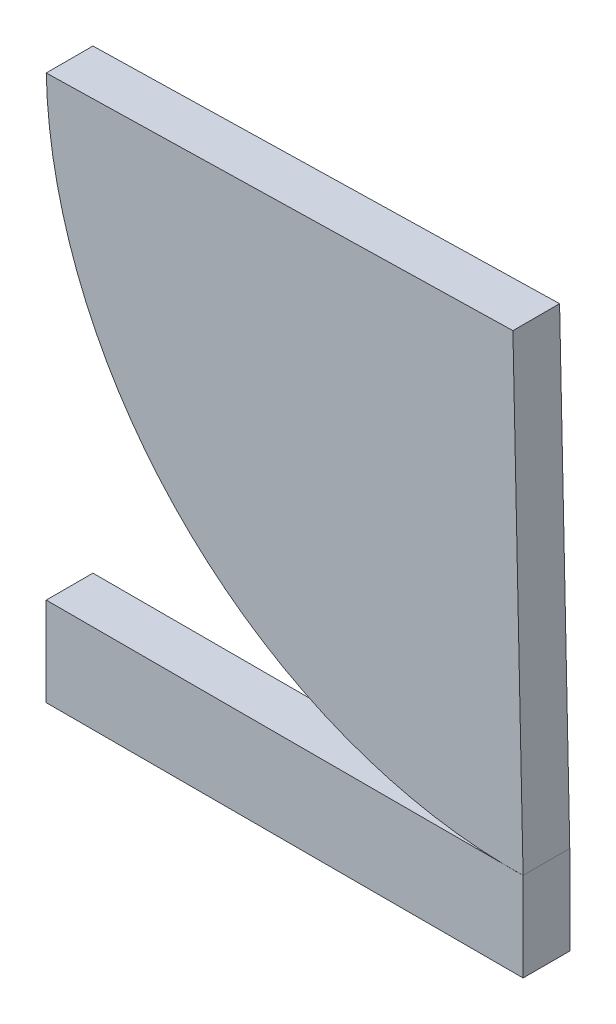
ISO-10303-21;
HEADER;
FILE_DESCRIPTION(('STEP AP214'),'2;1');
FILE_NAME('part.step','',(''),(''),'','','');
FILE_SCHEMA(('AUTOMOTIVE_DESIGN { 1 0 10303 214 1 1 1 1 }'));
ENDSEC;
DATA;
#1=APPLICATION_CONTEXT('core data for automotive mechanical design processes');
#2=APPLICATION_PROTOCOL_DEFINITION('international standard','automotive_design',2000,#1);
#3=PRODUCT_CONTEXT('',#1,'mechanical');
#4=PRODUCT('Part','Part','',(#3));
#5=PRODUCT_RELATED_PRODUCT_CATEGORY('part','',(#4));
#6=PRODUCT_DEFINITION_FORMATION('','',#4);
#7=PRODUCT_DEFINITION_CONTEXT('part definition',#1,'design');
#8=PRODUCT_DEFINITION('design','',#6,#7);
#9=PRODUCT_DEFINITION_SHAPE('','',#8);
#10=(LENGTH_UNIT() NAMED_UNIT(*) SI_UNIT(.MILLI.,.METRE.));
#11=(NAMED_UNIT(*) PLANE_ANGLE_UNIT() SI_UNIT($,.RADIAN.));
#12=(NAMED_UNIT(*) SI_UNIT($,.STERADIAN.) SOLID_ANGLE_UNIT());
#13=UNCERTAINTY_MEASURE_WITH_UNIT(LENGTH_MEASURE(1.E-05),#10,'distance_accuracy_value','');
#14=(GEOMETRIC_REPRESENTATION_CONTEXT(3) GLOBAL_UNCERTAINTY_ASSIGNED_CONTEXT((#13)) GLOBAL_UNIT_ASSIGNED_CONTEXT((#10,
#11,#12)) REPRESENTATION_CONTEXT('',''));
#15=CARTESIAN_POINT('',(0.,0.,0.));
#16=DIRECTION('',(0.,0.,1.));
#17=DIRECTION('',(1.,0.,0.));
#18=AXIS2_PLACEMENT_3D('',#15,#16,#17);
#19=CARTESIAN_POINT('',(0.218091207309155,0.,1.));
#20=DIRECTION('',(1.,0.,0.));
#21=DIRECTION('',(0.,0.,-1.));
#22=AXIS2_PLACEMENT_3D('',#19,#20,#21);
#23=PLANE('',#22);
#24=DIRECTION('',(0.,-1.,0.));
#25=VECTOR('',#24,1.);
#26=CARTESIAN_POINT('',(0.218091207309155,0.,0.));
#27=LINE('',#26,#25);
#28=CARTESIAN_POINT('',(0.218091207309155,-9.99762152840836,0.));
#29=VERTEX_POINT('',#28);
#30=CARTESIAN_POINT('',(0.218091207309155,-11.9014255080165,0.));
#31=VERTEX_POINT('',#30);
#32=EDGE_CURVE('E125',#29,#31,#27,.T.);
#33=ORIENTED_EDGE('',*,*,#32,.F.);
#34=DIRECTION('',(0.,0.,-1.));
#35=VECTOR('',#34,1.);
#36=CARTESIAN_POINT('',(0.218091207309155,-9.99762152840836,1.));
#37=LINE('',#36,#35);
#38=CARTESIAN_POINT('',(0.218091207309155,-9.99762152840836,1.));
#39=VERTEX_POINT('',#38);
#40=EDGE_CURVE('E12',#39,#29,#37,.T.);
#41=ORIENTED_EDGE('',*,*,#40,.F.);
#42=DIRECTION('',(0.,-1.,0.));
#43=VECTOR('',#42,1.);
#44=CARTESIAN_POINT('',(0.218091207309155,0.,1.));
#45=LINE('',#44,#43);
#46=CARTESIAN_POINT('',(0.218091207309155,-11.9014255080165,1.));
#47=VERTEX_POINT('',#46);
#48=EDGE_CURVE('E135',#39,#47,#45,.T.);
#49=ORIENTED_EDGE('',*,*,#48,.T.);
#50=DIRECTION('',(0.,0.,-1.));
#51=VECTOR('',#50,1.);
#52=CARTESIAN_POINT('',(0.218091207309155,-11.9014255080165,1.));
#53=LINE('',#52,#51);
#54=EDGE_CURVE('E67',#47,#31,#53,.T.);
#55=ORIENTED_EDGE('',*,*,#54,.T.);
#56=EDGE_LOOP('',(#33,#41,#49,#55));
#57=FACE_BOUND('',#56,.T.);
#58=ADVANCED_FACE('F51',(#57),#23,.T.);
#59=CARTESIAN_POINT('',(0.,0.,1.));
#60=DIRECTION('',(0.,0.,-1.));
#61=DIRECTION('',(-1.,0.,0.));
#62=AXIS2_PLACEMENT_3D('',#59,#60,#61);
#63=CYLINDRICAL_SURFACE('',#62,9.99999999999999);
#64=CARTESIAN_POINT('',(0.,0.,0.));
#65=DIRECTION('',(0.,0.,1.));
#66=DIRECTION('',(1.,0.,0.));
#67=AXIS2_PLACEMENT_3D('',#64,#65,#66);
#68=CIRCLE('',#67,9.99999999999999);
#69=CARTESIAN_POINT('',(-0.218091207309169,-9.99762152840836,0.));
#70=VERTEX_POINT('',#69);
#71=EDGE_CURVE('E127',#29,#70,#68,.F.);
#72=ORIENTED_EDGE('',*,*,#71,.T.);
#73=DIRECTION('',(0.,0.,-1.));
#74=VECTOR('',#73,1.);
#75=CARTESIAN_POINT('',(-0.218091207309169,-9.99762152840836,1.));
#76=LINE('',#75,#74);
#77=CARTESIAN_POINT('',(-0.218091207309169,-9.99762152840836,1.));
#78=VERTEX_POINT('',#77);
#79=EDGE_CURVE('E59',#78,#70,#76,.T.);
#80=ORIENTED_EDGE('',*,*,#79,.F.);
#81=CARTESIAN_POINT('',(0.,0.,1.));
#82=DIRECTION('',(0.,0.,1.));
#83=DIRECTION('',(1.,0.,0.));
#84=AXIS2_PLACEMENT_3D('',#81,#82,#83);
#85=CIRCLE('',#84,9.99999999999999);
#86=EDGE_CURVE('E106',#39,#78,#85,.F.);
#87=ORIENTED_EDGE('',*,*,#86,.F.);
#88=ORIENTED_EDGE('',*,*,#40,.T.);
#89=EDGE_LOOP('',(#72,#80,#87,#88));
#90=FACE_BOUND('',#89,.T.);
#91=ADVANCED_FACE('F152',(#90),#63,.F.);
#92=CARTESIAN_POINT('',(0.,-9.99762152840836,1.));
#93=DIRECTION('',(0.,-1.,0.));
#94=DIRECTION('',(0.,0.,-1.));
#95=AXIS2_PLACEMENT_3D('',#92,#93,#94);
#96=PLANE('',#95);
#97=DIRECTION('',(-1.,0.,0.));
#98=VECTOR('',#97,1.);
#99=CARTESIAN_POINT('',(0.,-9.99762152840836,0.));
#100=LINE('',#99,#98);
#101=CARTESIAN_POINT('',(-9.99762152840836,-9.99762152840836,0.));
#102=VERTEX_POINT('',#101);
#103=EDGE_CURVE('E115',#70,#102,#100,.T.);
#104=ORIENTED_EDGE('',*,*,#103,.T.);
#105=DIRECTION('',(0.,0.,-1.));
#106=VECTOR('',#105,1.);
#107=CARTESIAN_POINT('',(-9.99762152840836,-9.99762152840836,1.));
#108=LINE('',#107,#106);
#109=CARTESIAN_POINT('',(-9.99762152840836,-9.99762152840836,1.));
#110=VERTEX_POINT('',#109);
#111=EDGE_CURVE('E112',#110,#102,#108,.T.);
#112=ORIENTED_EDGE('',*,*,#111,.F.);
#113=DIRECTION('',(-1.,0.,0.));
#114=VECTOR('',#113,1.);
#115=CARTESIAN_POINT('',(0.,-9.99762152840836,1.));
#116=LINE('',#115,#114);
#117=EDGE_CURVE('E99',#78,#110,#116,.T.);
#118=ORIENTED_EDGE('',*,*,#117,.F.);
#119=ORIENTED_EDGE('',*,*,#79,.T.);
#120=EDGE_LOOP('',(#104,#112,#118,#119));
#121=FACE_BOUND('',#120,.T.);
#122=ADVANCED_FACE('F113',(#121),#96,.F.);
#123=CARTESIAN_POINT('',(-9.99762152840836,0.,1.));
#124=DIRECTION('',(1.,0.,0.));
#125=DIRECTION('',(0.,0.,-1.));
#126=AXIS2_PLACEMENT_3D('',#123,#124,#125);
#127=PLANE('',#126);
#128=DIRECTION('',(0.,-1.,0.));
#129=VECTOR('',#128,1.);
#130=CARTESIAN_POINT('',(-9.99762152840836,0.,0.));
#131=LINE('',#130,#129);
#132=CARTESIAN_POINT('',(-9.99762152840836,-11.9014255080165,0.));
#133=VERTEX_POINT('',#132);
#134=EDGE_CURVE('E130',#102,#133,#131,.T.);
#135=ORIENTED_EDGE('',*,*,#134,.T.);
#136=DIRECTION('',(0.,0.,-1.));
#137=VECTOR('',#136,1.);
#138=CARTESIAN_POINT('',(-9.99762152840836,-11.9014255080165,1.));
#139=LINE('',#138,#137);
#140=CARTESIAN_POINT('',(-9.99762152840836,-11.9014255080165,1.));
#141=VERTEX_POINT('',#140);
#142=EDGE_CURVE('E84',#141,#133,#139,.T.);
#143=ORIENTED_EDGE('',*,*,#142,.F.);
#144=DIRECTION('',(0.,-1.,0.));
#145=VECTOR('',#144,1.);
#146=CARTESIAN_POINT('',(-9.99762152840836,0.,1.));
#147=LINE('',#146,#145);
#148=EDGE_CURVE('E105',#110,#141,#147,.T.);
#149=ORIENTED_EDGE('',*,*,#148,.F.);
#150=ORIENTED_EDGE('',*,*,#111,.T.);
#151=EDGE_LOOP('',(#135,#143,#149,#150));
#152=FACE_BOUND('',#151,.T.);
#153=ADVANCED_FACE('F119',(#152),#127,.F.);
#154=CARTESIAN_POINT('',(0.,-11.9014255080165,1.));
#155=DIRECTION('',(0.,-1.,0.));
#156=DIRECTION('',(0.,0.,-1.));
#157=AXIS2_PLACEMENT_3D('',#154,#155,#156);
#158=PLANE('',#157);
#159=DIRECTION('',(-1.,0.,0.));
#160=VECTOR('',#159,1.);
#161=CARTESIAN_POINT('',(0.,-11.9014255080165,0.));
#162=LINE('',#161,#160);
#163=EDGE_CURVE('E132',#31,#133,#162,.T.);
#164=ORIENTED_EDGE('',*,*,#163,.F.);
#165=ORIENTED_EDGE('',*,*,#54,.F.);
#166=DIRECTION('',(-1.,0.,0.));
#167=VECTOR('',#166,1.);
#168=CARTESIAN_POINT('',(0.,-11.9014255080165,1.));
#169=LINE('',#168,#167);
#170=EDGE_CURVE('E120',#47,#141,#169,.T.);
#171=ORIENTED_EDGE('',*,*,#170,.T.);
#172=ORIENTED_EDGE('',*,*,#142,.T.);
#173=EDGE_LOOP('',(#164,#165,#171,#172));
#174=FACE_BOUND('',#173,.T.);
#175=ADVANCED_FACE('F141',(#174),#158,.T.);
#176=CARTESIAN_POINT('',(0.,0.,1.));
#177=DIRECTION('',(0.,0.,1.));
#178=DIRECTION('',(1.,0.,0.));
#179=AXIS2_PLACEMENT_3D('',#176,#177,#178);
#180=PLANE('',#179);
#181=ORIENTED_EDGE('',*,*,#48,.F.);
#182=ORIENTED_EDGE('',*,*,#86,.T.);
#183=ORIENTED_EDGE('',*,*,#117,.T.);
#184=ORIENTED_EDGE('',*,*,#148,.T.);
#185=ORIENTED_EDGE('',*,*,#170,.F.);
#186=EDGE_LOOP('',(#181,#182,#183,#184,#185));
#187=FACE_BOUND('',#186,.T.);
#188=ADVANCED_FACE('F102',(#187),#180,.T.);
#189=CARTESIAN_POINT('',(0.,0.,0.));
#190=DIRECTION('',(0.,0.,1.));
#191=DIRECTION('',(1.,0.,0.));
#192=AXIS2_PLACEMENT_3D('',#189,#190,#191);
#193=PLANE('',#192);
#194=ORIENTED_EDGE('',*,*,#32,.T.);
#195=ORIENTED_EDGE('',*,*,#163,.T.);
#196=ORIENTED_EDGE('',*,*,#134,.F.);
#197=ORIENTED_EDGE('',*,*,#103,.F.);
#198=ORIENTED_EDGE('',*,*,#71,.F.);
#199=EDGE_LOOP('',(#194,#195,#196,#197,#198));
#200=FACE_BOUND('',#199,.T.);
#201=ADVANCED_FACE('F140',(#200),#193,.F.);
#202=CLOSED_SHELL('',(#58,#91,#122,#153,#175,#188,#201));
#203=MANIFOLD_SOLID_BREP('B2',#202);
#204=CARTESIAN_POINT('',(0.,0.,1.));
#205=DIRECTION('',(0.,0.,-1.));
#206=DIRECTION('',(-1.,0.,0.));
#207=AXIS2_PLACEMENT_3D('',#204,#205,#206);
#208=CYLINDRICAL_SURFACE('',#207,9.99999999999999);
#209=CARTESIAN_POINT('',(0.,0.,0.));
#210=DIRECTION('',(0.,0.,1.));
#211=DIRECTION('',(1.,0.,0.));
#212=AXIS2_PLACEMENT_3D('',#209,#210,#211);
#213=CIRCLE('',#212,9.99999999999999);
#214=CARTESIAN_POINT('',(-0.218091207309169,-9.99762152840836,0.));
#215=VERTEX_POINT('',#214);
#216=CARTESIAN_POINT('',(-9.99762152840836,-0.218091207309155,0.));
#217=VERTEX_POINT('',#216);
#218=EDGE_CURVE('E268',#215,#217,#213,.F.);
#219=ORIENTED_EDGE('',*,*,#218,.F.);
#220=DIRECTION('',(0.,0.,-1.));
#221=VECTOR('',#220,1.);
#222=CARTESIAN_POINT('',(-0.218091207309169,-9.99762152840836,1.));
#223=LINE('',#222,#221);
#224=CARTESIAN_POINT('',(-0.218091207309169,-9.99762152840836,1.));
#225=VERTEX_POINT('',#224);
#226=EDGE_CURVE('E49',#225,#215,#223,.T.);
#227=ORIENTED_EDGE('',*,*,#226,.F.);
#228=CARTESIAN_POINT('',(0.,0.,1.));
#229=DIRECTION('',(0.,0.,1.));
#230=DIRECTION('',(1.,0.,0.));
#231=AXIS2_PLACEMENT_3D('',#228,#229,#230);
#232=CIRCLE('',#231,9.99999999999999);
#233=CARTESIAN_POINT('',(-9.99762152840836,-0.218091207309155,1.));
#234=VERTEX_POINT('',#233);
#235=EDGE_CURVE('E260',#225,#234,#232,.F.);
#236=ORIENTED_EDGE('',*,*,#235,.T.);
#237=DIRECTION('',(0.,0.,-1.));
#238=VECTOR('',#237,1.);
#239=CARTESIAN_POINT('',(-9.99762152840836,-0.218091207309155,1.));
#240=LINE('',#239,#238);
#241=EDGE_CURVE('E221',#234,#217,#240,.T.);
#242=ORIENTED_EDGE('',*,*,#241,.T.);
#243=EDGE_LOOP('',(#219,#227,#236,#242));
#244=FACE_BOUND('',#243,.T.);
#245=ADVANCED_FACE('F205',(#244),#208,.T.);
#246=CARTESIAN_POINT('',(0.,-9.99762152840836,1.));
#247=DIRECTION('',(0.,-1.,0.));
#248=DIRECTION('',(0.,0.,-1.));
#249=AXIS2_PLACEMENT_3D('',#246,#247,#248);
#250=PLANE('',#249);
#251=DIRECTION('',(-1.,0.,0.));
#252=VECTOR('',#251,1.);
#253=CARTESIAN_POINT('',(0.,-9.99762152840836,0.));
#254=LINE('',#253,#252);
#255=CARTESIAN_POINT('',(0.218091207309155,-9.99762152840836,0.));
#256=VERTEX_POINT('',#255);
#257=EDGE_CURVE('E251',#256,#215,#254,.T.);
#258=ORIENTED_EDGE('',*,*,#257,.F.);
#259=DIRECTION('',(0.,0.,-1.));
#260=VECTOR('',#259,1.);
#261=CARTESIAN_POINT('',(0.218091207309155,-9.99762152840836,1.));
#262=LINE('',#261,#260);
#263=CARTESIAN_POINT('',(0.218091207309155,-9.99762152840836,1.));
#264=VERTEX_POINT('',#263);
#265=EDGE_CURVE('E213',#264,#256,#262,.T.);
#266=ORIENTED_EDGE('',*,*,#265,.F.);
#267=DIRECTION('',(-1.,0.,0.));
#268=VECTOR('',#267,1.);
#269=CARTESIAN_POINT('',(0.,-9.99762152840836,1.));
#270=LINE('',#269,#268);
#271=EDGE_CURVE('E249',#264,#225,#270,.T.);
#272=ORIENTED_EDGE('',*,*,#271,.T.);
#273=ORIENTED_EDGE('',*,*,#226,.T.);
#274=EDGE_LOOP('',(#258,#266,#272,#273));
#275=FACE_BOUND('',#274,.T.);
#276=ADVANCED_FACE('F248',(#275),#250,.T.);
#277=CARTESIAN_POINT('',(0.,0.,1.));
#278=DIRECTION('',(0.999762152840837,0.0218091207309155,0.));
#279=DIRECTION('',(-0.0218091207309155,0.999762152840837,0.));
#280=AXIS2_PLACEMENT_3D('',#277,#278,#279);
#281=PLANE('',#280);
#282=DIRECTION('',(0.0218091207309155,-0.999762152840837,0.));
#283=VECTOR('',#282,1.);
#284=CARTESIAN_POINT('',(0.,0.,0.));
#285=LINE('',#284,#283);
#286=CARTESIAN_POINT('',(0.,0.,0.));
#287=VERTEX_POINT('',#286);
#288=EDGE_CURVE('E271',#287,#256,#285,.T.);
#289=ORIENTED_EDGE('',*,*,#288,.F.);
#290=DIRECTION('',(0.,0.,-1.));
#291=VECTOR('',#290,1.);
#292=CARTESIAN_POINT('',(0.,0.,1.));
#293=LINE('',#292,#291);
#294=CARTESIAN_POINT('',(0.,0.,1.));
#295=VERTEX_POINT('',#294);
#296=EDGE_CURVE('E234',#295,#287,#293,.T.);
#297=ORIENTED_EDGE('',*,*,#296,.F.);
#298=DIRECTION('',(0.0218091207309155,-0.999762152840837,0.));
#299=VECTOR('',#298,1.);
#300=CARTESIAN_POINT('',(0.,0.,1.));
#301=LINE('',#300,#299);
#302=EDGE_CURVE('E259',#295,#264,#301,.T.);
#303=ORIENTED_EDGE('',*,*,#302,.T.);
#304=ORIENTED_EDGE('',*,*,#265,.T.);
#305=EDGE_LOOP('',(#289,#297,#303,#304));
#306=FACE_BOUND('',#305,.T.);
#307=ADVANCED_FACE('F262',(#306),#281,.T.);
#308=CARTESIAN_POINT('',(0.,0.,1.));
#309=DIRECTION('',(-0.0218091207309155,0.999762152840837,0.));
#310=DIRECTION('',(-0.999762152840837,-0.0218091207309155,0.));
#311=AXIS2_PLACEMENT_3D('',#308,#309,#310);
#312=PLANE('',#311);
#313=DIRECTION('',(0.999762152840837,0.0218091207309155,0.));
#314=VECTOR('',#313,1.);
#315=CARTESIAN_POINT('',(0.,0.,0.));
#316=LINE('',#315,#314);
#317=EDGE_CURVE('E273',#217,#287,#316,.T.);
#318=ORIENTED_EDGE('',*,*,#317,.F.);
#319=ORIENTED_EDGE('',*,*,#241,.F.);
#320=DIRECTION('',(0.999762152840837,0.0218091207309155,0.));
#321=VECTOR('',#320,1.);
#322=CARTESIAN_POINT('',(0.,0.,1.));
#323=LINE('',#322,#321);
#324=EDGE_CURVE('E263',#234,#295,#323,.T.);
#325=ORIENTED_EDGE('',*,*,#324,.T.);
#326=ORIENTED_EDGE('',*,*,#296,.T.);
#327=EDGE_LOOP('',(#318,#319,#325,#326));
#328=FACE_BOUND('',#327,.T.);
#329=ADVANCED_FACE('F278',(#328),#312,.T.);
#330=CARTESIAN_POINT('',(0.,0.,1.));
#331=DIRECTION('',(0.,0.,1.));
#332=DIRECTION('',(1.,0.,0.));
#333=AXIS2_PLACEMENT_3D('',#330,#331,#332);
#334=PLANE('',#333);
#335=ORIENTED_EDGE('',*,*,#235,.F.);
#336=ORIENTED_EDGE('',*,*,#271,.F.);
#337=ORIENTED_EDGE('',*,*,#302,.F.);
#338=ORIENTED_EDGE('',*,*,#324,.F.);
#339=EDGE_LOOP('',(#335,#336,#337,#338));
#340=FACE_BOUND('',#339,.T.);
#341=ADVANCED_FACE('F257',(#340),#334,.T.);
#342=CARTESIAN_POINT('',(0.,0.,0.));
#343=DIRECTION('',(0.,0.,1.));
#344=DIRECTION('',(1.,0.,0.));
#345=AXIS2_PLACEMENT_3D('',#342,#343,#344);
#346=PLANE('',#345);
#347=ORIENTED_EDGE('',*,*,#218,.T.);
#348=ORIENTED_EDGE('',*,*,#317,.T.);
#349=ORIENTED_EDGE('',*,*,#288,.T.);
#350=ORIENTED_EDGE('',*,*,#257,.T.);
#351=EDGE_LOOP('',(#347,#348,#349,#350));
#352=FACE_BOUND('',#351,.T.);
#353=ADVANCED_FACE('F285',(#352),#346,.F.);
#354=CLOSED_SHELL('',(#245,#276,#307,#329,#341,#353));
#355=MANIFOLD_SOLID_BREP('B6',#354);
#356=ADVANCED_BREP_SHAPE_REPRESENTATION('',(#18,#203,#355),#14);
#357=SHAPE_DEFINITION_REPRESENTATION(#9,#356);
ENDSEC;
END-ISO-10303-21;
